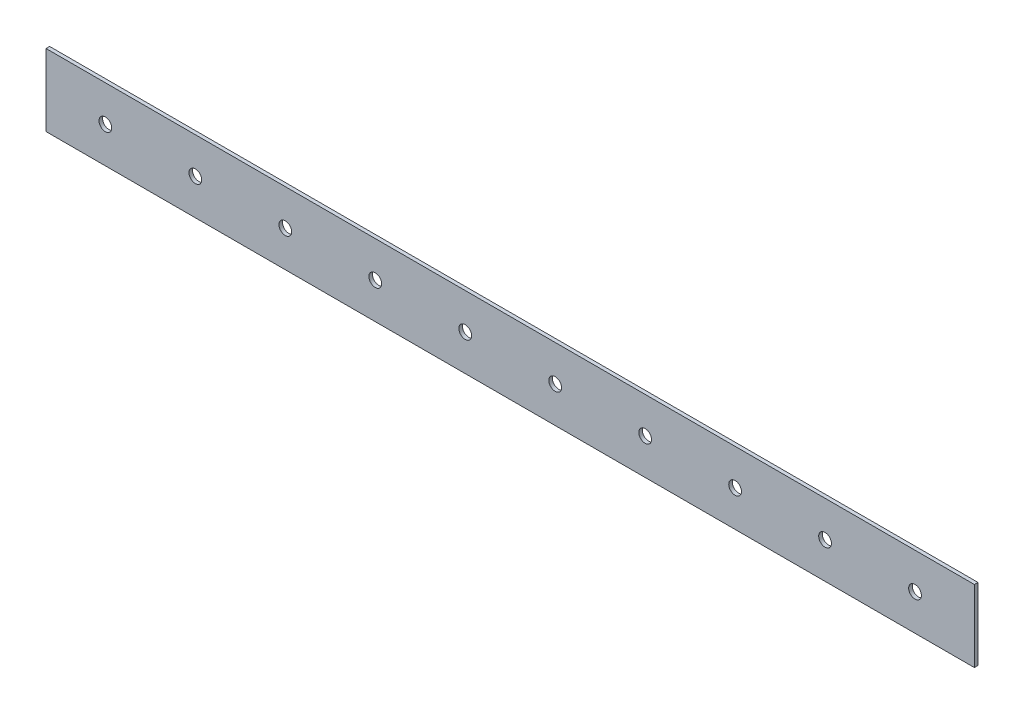
ISO-10303-21;
HEADER;
FILE_DESCRIPTION(('STEP AP214'),'2;1');
FILE_NAME('part.step','',(''),(''),'','','');
FILE_SCHEMA(('AUTOMOTIVE_DESIGN { 1 0 10303 214 1 1 1 1 }'));
ENDSEC;
DATA;
#1=APPLICATION_CONTEXT('core data for automotive mechanical design processes');
#2=APPLICATION_PROTOCOL_DEFINITION('international standard','automotive_design',2000,#1);
#3=PRODUCT_CONTEXT('',#1,'mechanical');
#4=PRODUCT('Part','Part','',(#3));
#5=PRODUCT_RELATED_PRODUCT_CATEGORY('part','',(#4));
#6=PRODUCT_DEFINITION_FORMATION('','',#4);
#7=PRODUCT_DEFINITION_CONTEXT('part definition',#1,'design');
#8=PRODUCT_DEFINITION('design','',#6,#7);
#9=PRODUCT_DEFINITION_SHAPE('','',#8);
#10=(LENGTH_UNIT() NAMED_UNIT(*) SI_UNIT(.MILLI.,.METRE.));
#11=(NAMED_UNIT(*) PLANE_ANGLE_UNIT() SI_UNIT($,.RADIAN.));
#12=(NAMED_UNIT(*) SI_UNIT($,.STERADIAN.) SOLID_ANGLE_UNIT());
#13=UNCERTAINTY_MEASURE_WITH_UNIT(LENGTH_MEASURE(1.E-05),#10,'distance_accuracy_value','');
#14=(GEOMETRIC_REPRESENTATION_CONTEXT(3) GLOBAL_UNCERTAINTY_ASSIGNED_CONTEXT((#13)) GLOBAL_UNIT_ASSIGNED_CONTEXT((#10,
#11,#12)) REPRESENTATION_CONTEXT('',''));
#15=CARTESIAN_POINT('',(0.,0.,0.));
#16=DIRECTION('',(0.,0.,1.));
#17=DIRECTION('',(1.,0.,0.));
#18=AXIS2_PLACEMENT_3D('',#15,#16,#17);
#19=CARTESIAN_POINT('',(0.,0.,1.));
#20=DIRECTION('',(0.,0.,1.));
#21=DIRECTION('',(1.,0.,0.));
#22=AXIS2_PLACEMENT_3D('',#19,#20,#21);
#23=PLANE('',#22);
#24=CARTESIAN_POINT('',(37.5000000000001,0.,1.));
#25=DIRECTION('',(0.,0.,1.));
#26=DIRECTION('',(-1.,0.,0.));
#27=AXIS2_PLACEMENT_3D('',#24,#25,#26);
#28=CIRCLE('',#27,1.77114070835533);
#29=CARTESIAN_POINT('',(35.7288592916447,0.,1.));
#30=VERTEX_POINT('',#29);
#31=EDGE_CURVE('E190',#30,#30,#28,.T.);
#32=ORIENTED_EDGE('',*,*,#31,.F.);
#33=EDGE_LOOP('',(#32));
#34=FACE_BOUND('',#33,.T.);
#35=CARTESIAN_POINT('',(87.5000000000001,0.,1.));
#36=DIRECTION('',(0.,0.,1.));
#37=DIRECTION('',(-1.,0.,0.));
#38=AXIS2_PLACEMENT_3D('',#35,#36,#37);
#39=CIRCLE('',#38,1.77114070835534);
#40=CARTESIAN_POINT('',(85.7288592916447,0.,1.));
#41=VERTEX_POINT('',#40);
#42=EDGE_CURVE('E174',#41,#41,#39,.T.);
#43=ORIENTED_EDGE('',*,*,#42,.F.);
#44=EDGE_LOOP('',(#43));
#45=FACE_BOUND('',#44,.T.);
#46=CARTESIAN_POINT('',(-112.5,-7.03296523219515E-13,1.));
#47=DIRECTION('',(0.,0.,1.));
#48=DIRECTION('',(1.,0.,0.));
#49=AXIS2_PLACEMENT_3D('',#46,#47,#48);
#50=CIRCLE('',#49,1.77114070835532);
#51=CARTESIAN_POINT('',(-110.728859291645,-7.03296523219515E-13,1.));
#52=VERTEX_POINT('',#51);
#53=EDGE_CURVE('E158',#52,#52,#50,.T.);
#54=ORIENTED_EDGE('',*,*,#53,.F.);
#55=EDGE_LOOP('',(#54));
#56=FACE_BOUND('',#55,.T.);
#57=CARTESIAN_POINT('',(-62.5,-3.54148389335201E-13,1.));
#58=DIRECTION('',(0.,0.,1.));
#59=DIRECTION('',(1.,0.,0.));
#60=AXIS2_PLACEMENT_3D('',#57,#58,#59);
#61=CIRCLE('',#60,1.77114070835534);
#62=CARTESIAN_POINT('',(-60.7288592916447,-3.54148389335201E-13,1.));
#63=VERTEX_POINT('',#62);
#64=EDGE_CURVE('E142',#63,#63,#61,.T.);
#65=ORIENTED_EDGE('',*,*,#64,.F.);
#66=EDGE_LOOP('',(#65));
#67=FACE_BOUND('',#66,.T.);
#68=CARTESIAN_POINT('',(-12.5,0.,1.));
#69=DIRECTION('',(0.,0.,1.));
#70=DIRECTION('',(1.,0.,0.));
#71=AXIS2_PLACEMENT_3D('',#68,#69,#70);
#72=CIRCLE('',#71,1.77114070835533);
#73=CARTESIAN_POINT('',(-10.7288592916447,0.,1.));
#74=VERTEX_POINT('',#73);
#75=EDGE_CURVE('E112',#74,#74,#72,.T.);
#76=ORIENTED_EDGE('',*,*,#75,.F.);
#77=EDGE_LOOP('',(#76));
#78=FACE_BOUND('',#77,.T.);
#79=DIRECTION('',(0.,1.,0.));
#80=VECTOR('',#79,1.);
#81=CARTESIAN_POINT('',(129.,10.,1.));
#82=LINE('',#81,#80);
#83=CARTESIAN_POINT('',(129.,-10.,1.));
#84=VERTEX_POINT('',#83);
#85=CARTESIAN_POINT('',(129.,10.,1.));
#86=VERTEX_POINT('',#85);
#87=EDGE_CURVE('E92',#84,#86,#82,.T.);
#88=ORIENTED_EDGE('',*,*,#87,.T.);
#89=DIRECTION('',(-1.,0.,0.));
#90=VECTOR('',#89,1.);
#91=CARTESIAN_POINT('',(-129.,10.,1.));
#92=LINE('',#91,#90);
#93=CARTESIAN_POINT('',(-129.,10.,1.));
#94=VERTEX_POINT('',#93);
#95=EDGE_CURVE('E87',#86,#94,#92,.T.);
#96=ORIENTED_EDGE('',*,*,#95,.T.);
#97=DIRECTION('',(0.,-1.,0.));
#98=VECTOR('',#97,1.);
#99=CARTESIAN_POINT('',(-129.,10.,1.));
#100=LINE('',#99,#98);
#101=CARTESIAN_POINT('',(-129.,-10.,1.));
#102=VERTEX_POINT('',#101);
#103=EDGE_CURVE('E90',#94,#102,#100,.T.);
#104=ORIENTED_EDGE('',*,*,#103,.T.);
#105=DIRECTION('',(1.,0.,0.));
#106=VECTOR('',#105,1.);
#107=CARTESIAN_POINT('',(-129.,-10.,1.));
#108=LINE('',#107,#106);
#109=EDGE_CURVE('E57',#102,#84,#108,.T.);
#110=ORIENTED_EDGE('',*,*,#109,.T.);
#111=EDGE_LOOP('',(#88,#96,#104,#110));
#112=FACE_BOUND('',#111,.T.);
#113=CARTESIAN_POINT('',(-37.5,-1.79574322393045E-13,1.));
#114=DIRECTION('',(0.,0.,1.));
#115=DIRECTION('',(1.,0.,0.));
#116=AXIS2_PLACEMENT_3D('',#113,#114,#115);
#117=CIRCLE('',#116,1.77114070835533);
#118=CARTESIAN_POINT('',(-35.7288592916447,-1.79574322393045E-13,1.));
#119=VERTEX_POINT('',#118);
#120=EDGE_CURVE('E134',#119,#119,#117,.T.);
#121=ORIENTED_EDGE('',*,*,#120,.F.);
#122=EDGE_LOOP('',(#121));
#123=FACE_BOUND('',#122,.T.);
#124=CARTESIAN_POINT('',(-87.5,-5.28722456277358E-13,1.));
#125=DIRECTION('',(0.,0.,1.));
#126=DIRECTION('',(1.,0.,0.));
#127=AXIS2_PLACEMENT_3D('',#124,#125,#126);
#128=CIRCLE('',#127,1.77114070835534);
#129=CARTESIAN_POINT('',(-85.7288592916447,-5.28722456277358E-13,1.));
#130=VERTEX_POINT('',#129);
#131=EDGE_CURVE('E150',#130,#130,#128,.T.);
#132=ORIENTED_EDGE('',*,*,#131,.F.);
#133=EDGE_LOOP('',(#132));
#134=FACE_BOUND('',#133,.T.);
#135=CARTESIAN_POINT('',(112.5,0.,1.));
#136=DIRECTION('',(0.,0.,1.));
#137=DIRECTION('',(-1.,0.,0.));
#138=AXIS2_PLACEMENT_3D('',#135,#136,#137);
#139=CIRCLE('',#138,1.77114070835532);
#140=CARTESIAN_POINT('',(110.728859291645,0.,1.));
#141=VERTEX_POINT('',#140);
#142=EDGE_CURVE('E166',#141,#141,#139,.T.);
#143=ORIENTED_EDGE('',*,*,#142,.F.);
#144=EDGE_LOOP('',(#143));
#145=FACE_BOUND('',#144,.T.);
#146=CARTESIAN_POINT('',(62.5000000000001,0.,1.));
#147=DIRECTION('',(0.,0.,1.));
#148=DIRECTION('',(-1.,0.,0.));
#149=AXIS2_PLACEMENT_3D('',#146,#147,#148);
#150=CIRCLE('',#149,1.77114070835534);
#151=CARTESIAN_POINT('',(60.7288592916447,0.,1.));
#152=VERTEX_POINT('',#151);
#153=EDGE_CURVE('E182',#152,#152,#150,.T.);
#154=ORIENTED_EDGE('',*,*,#153,.F.);
#155=EDGE_LOOP('',(#154));
#156=FACE_BOUND('',#155,.T.);
#157=CARTESIAN_POINT('',(12.5000000000001,0.,1.));
#158=DIRECTION('',(0.,0.,1.));
#159=DIRECTION('',(-1.,0.,0.));
#160=AXIS2_PLACEMENT_3D('',#157,#158,#159);
#161=CIRCLE('',#160,1.77114070835534);
#162=CARTESIAN_POINT('',(10.7288592916447,0.,1.));
#163=VERTEX_POINT('',#162);
#164=EDGE_CURVE('E198',#163,#163,#161,.T.);
#165=ORIENTED_EDGE('',*,*,#164,.F.);
#166=EDGE_LOOP('',(#165));
#167=FACE_BOUND('',#166,.T.);
#168=ADVANCED_FACE('F39',(#34,#45,#56,#67,#78,#112,#123,#134,#145,#156,#167),#23,.T.);
#169=CARTESIAN_POINT('',(0.,0.,0.));
#170=DIRECTION('',(0.,0.,1.));
#171=DIRECTION('',(1.,0.,0.));
#172=AXIS2_PLACEMENT_3D('',#169,#170,#171);
#173=PLANE('',#172);
#174=DIRECTION('',(0.,1.,0.));
#175=VECTOR('',#174,1.);
#176=CARTESIAN_POINT('',(129.,10.,0.));
#177=LINE('',#176,#175);
#178=CARTESIAN_POINT('',(129.,-10.,0.));
#179=VERTEX_POINT('',#178);
#180=CARTESIAN_POINT('',(129.,10.,0.));
#181=VERTEX_POINT('',#180);
#182=EDGE_CURVE('E108',#179,#181,#177,.T.);
#183=ORIENTED_EDGE('',*,*,#182,.F.);
#184=DIRECTION('',(1.,0.,0.));
#185=VECTOR('',#184,1.);
#186=CARTESIAN_POINT('',(-129.,-10.,0.));
#187=LINE('',#186,#185);
#188=CARTESIAN_POINT('',(-129.,-10.,0.));
#189=VERTEX_POINT('',#188);
#190=EDGE_CURVE('E80',#189,#179,#187,.T.);
#191=ORIENTED_EDGE('',*,*,#190,.F.);
#192=DIRECTION('',(0.,-1.,0.));
#193=VECTOR('',#192,1.);
#194=CARTESIAN_POINT('',(-129.,10.,0.));
#195=LINE('',#194,#193);
#196=CARTESIAN_POINT('',(-129.,10.,0.));
#197=VERTEX_POINT('',#196);
#198=EDGE_CURVE('E74',#197,#189,#195,.T.);
#199=ORIENTED_EDGE('',*,*,#198,.F.);
#200=DIRECTION('',(-1.,0.,0.));
#201=VECTOR('',#200,1.);
#202=CARTESIAN_POINT('',(-129.,10.,0.));
#203=LINE('',#202,#201);
#204=EDGE_CURVE('E97',#181,#197,#203,.T.);
#205=ORIENTED_EDGE('',*,*,#204,.F.);
#206=EDGE_LOOP('',(#183,#191,#199,#205));
#207=FACE_BOUND('',#206,.T.);
#208=CARTESIAN_POINT('',(-12.5,0.,0.));
#209=DIRECTION('',(0.,0.,1.));
#210=DIRECTION('',(1.,0.,0.));
#211=AXIS2_PLACEMENT_3D('',#208,#209,#210);
#212=CIRCLE('',#211,1.77114070835533);
#213=CARTESIAN_POINT('',(-10.7288592916447,0.,0.));
#214=VERTEX_POINT('',#213);
#215=EDGE_CURVE('E130',#214,#214,#212,.T.);
#216=ORIENTED_EDGE('',*,*,#215,.T.);
#217=EDGE_LOOP('',(#216));
#218=FACE_BOUND('',#217,.T.);
#219=CARTESIAN_POINT('',(-37.5,-1.79574322393045E-13,0.));
#220=DIRECTION('',(0.,0.,1.));
#221=DIRECTION('',(1.,0.,0.));
#222=AXIS2_PLACEMENT_3D('',#219,#220,#221);
#223=CIRCLE('',#222,1.77114070835533);
#224=CARTESIAN_POINT('',(-35.7288592916447,-1.79574322393045E-13,0.));
#225=VERTEX_POINT('',#224);
#226=EDGE_CURVE('E138',#225,#225,#223,.T.);
#227=ORIENTED_EDGE('',*,*,#226,.T.);
#228=EDGE_LOOP('',(#227));
#229=FACE_BOUND('',#228,.T.);
#230=CARTESIAN_POINT('',(-62.5,-3.54148389335201E-13,0.));
#231=DIRECTION('',(0.,0.,1.));
#232=DIRECTION('',(1.,0.,0.));
#233=AXIS2_PLACEMENT_3D('',#230,#231,#232);
#234=CIRCLE('',#233,1.77114070835534);
#235=CARTESIAN_POINT('',(-60.7288592916447,-3.54148389335201E-13,0.));
#236=VERTEX_POINT('',#235);
#237=EDGE_CURVE('E146',#236,#236,#234,.T.);
#238=ORIENTED_EDGE('',*,*,#237,.T.);
#239=EDGE_LOOP('',(#238));
#240=FACE_BOUND('',#239,.T.);
#241=CARTESIAN_POINT('',(-87.5,-5.28722456277358E-13,0.));
#242=DIRECTION('',(0.,0.,1.));
#243=DIRECTION('',(1.,0.,0.));
#244=AXIS2_PLACEMENT_3D('',#241,#242,#243);
#245=CIRCLE('',#244,1.77114070835534);
#246=CARTESIAN_POINT('',(-85.7288592916447,-5.28722456277358E-13,0.));
#247=VERTEX_POINT('',#246);
#248=EDGE_CURVE('E154',#247,#247,#245,.T.);
#249=ORIENTED_EDGE('',*,*,#248,.T.);
#250=EDGE_LOOP('',(#249));
#251=FACE_BOUND('',#250,.T.);
#252=CARTESIAN_POINT('',(-112.5,-7.03296523219515E-13,0.));
#253=DIRECTION('',(0.,0.,1.));
#254=DIRECTION('',(1.,0.,0.));
#255=AXIS2_PLACEMENT_3D('',#252,#253,#254);
#256=CIRCLE('',#255,1.77114070835532);
#257=CARTESIAN_POINT('',(-110.728859291645,-7.03296523219515E-13,0.));
#258=VERTEX_POINT('',#257);
#259=EDGE_CURVE('E162',#258,#258,#256,.T.);
#260=ORIENTED_EDGE('',*,*,#259,.T.);
#261=EDGE_LOOP('',(#260));
#262=FACE_BOUND('',#261,.T.);
#263=CARTESIAN_POINT('',(112.5,0.,0.));
#264=DIRECTION('',(0.,0.,1.));
#265=DIRECTION('',(-1.,0.,0.));
#266=AXIS2_PLACEMENT_3D('',#263,#264,#265);
#267=CIRCLE('',#266,1.77114070835532);
#268=CARTESIAN_POINT('',(110.728859291645,0.,0.));
#269=VERTEX_POINT('',#268);
#270=EDGE_CURVE('E170',#269,#269,#267,.T.);
#271=ORIENTED_EDGE('',*,*,#270,.T.);
#272=EDGE_LOOP('',(#271));
#273=FACE_BOUND('',#272,.T.);
#274=CARTESIAN_POINT('',(87.5000000000001,0.,0.));
#275=DIRECTION('',(0.,0.,1.));
#276=DIRECTION('',(-1.,0.,0.));
#277=AXIS2_PLACEMENT_3D('',#274,#275,#276);
#278=CIRCLE('',#277,1.77114070835534);
#279=CARTESIAN_POINT('',(85.7288592916447,0.,0.));
#280=VERTEX_POINT('',#279);
#281=EDGE_CURVE('E178',#280,#280,#278,.T.);
#282=ORIENTED_EDGE('',*,*,#281,.T.);
#283=EDGE_LOOP('',(#282));
#284=FACE_BOUND('',#283,.T.);
#285=CARTESIAN_POINT('',(62.5000000000001,0.,0.));
#286=DIRECTION('',(0.,0.,1.));
#287=DIRECTION('',(-1.,0.,0.));
#288=AXIS2_PLACEMENT_3D('',#285,#286,#287);
#289=CIRCLE('',#288,1.77114070835534);
#290=CARTESIAN_POINT('',(60.7288592916447,0.,0.));
#291=VERTEX_POINT('',#290);
#292=EDGE_CURVE('E186',#291,#291,#289,.T.);
#293=ORIENTED_EDGE('',*,*,#292,.T.);
#294=EDGE_LOOP('',(#293));
#295=FACE_BOUND('',#294,.T.);
#296=CARTESIAN_POINT('',(37.5000000000001,0.,0.));
#297=DIRECTION('',(0.,0.,1.));
#298=DIRECTION('',(-1.,0.,0.));
#299=AXIS2_PLACEMENT_3D('',#296,#297,#298);
#300=CIRCLE('',#299,1.77114070835533);
#301=CARTESIAN_POINT('',(35.7288592916447,0.,0.));
#302=VERTEX_POINT('',#301);
#303=EDGE_CURVE('E194',#302,#302,#300,.T.);
#304=ORIENTED_EDGE('',*,*,#303,.T.);
#305=EDGE_LOOP('',(#304));
#306=FACE_BOUND('',#305,.T.);
#307=CARTESIAN_POINT('',(12.5000000000001,0.,0.));
#308=DIRECTION('',(0.,0.,1.));
#309=DIRECTION('',(-1.,0.,0.));
#310=AXIS2_PLACEMENT_3D('',#307,#308,#309);
#311=CIRCLE('',#310,1.77114070835534);
#312=CARTESIAN_POINT('',(10.7288592916447,0.,0.));
#313=VERTEX_POINT('',#312);
#314=EDGE_CURVE('E202',#313,#313,#311,.T.);
#315=ORIENTED_EDGE('',*,*,#314,.T.);
#316=EDGE_LOOP('',(#315));
#317=FACE_BOUND('',#316,.T.);
#318=ADVANCED_FACE('F125',(#207,#218,#229,#240,#251,#262,#273,#284,#295,#306,#317),#173,.F.);
#319=CARTESIAN_POINT('',(129.,10.,1.));
#320=DIRECTION('',(-1.,0.,0.));
#321=DIRECTION('',(0.,0.,1.));
#322=AXIS2_PLACEMENT_3D('',#319,#320,#321);
#323=PLANE('',#322);
#324=ORIENTED_EDGE('',*,*,#182,.T.);
#325=DIRECTION('',(0.,0.,-1.));
#326=VECTOR('',#325,1.);
#327=CARTESIAN_POINT('',(129.,10.,1.));
#328=LINE('',#327,#326);
#329=EDGE_CURVE('E11',#86,#181,#328,.T.);
#330=ORIENTED_EDGE('',*,*,#329,.F.);
#331=ORIENTED_EDGE('',*,*,#87,.F.);
#332=DIRECTION('',(0.,0.,-1.));
#333=VECTOR('',#332,1.);
#334=CARTESIAN_POINT('',(129.,-10.,1.));
#335=LINE('',#334,#333);
#336=EDGE_CURVE('E104',#84,#179,#335,.T.);
#337=ORIENTED_EDGE('',*,*,#336,.T.);
#338=EDGE_LOOP('',(#324,#330,#331,#337));
#339=FACE_BOUND('',#338,.T.);
#340=ADVANCED_FACE('F41',(#339),#323,.F.);
#341=CARTESIAN_POINT('',(-129.,10.,1.));
#342=DIRECTION('',(0.,-1.,0.));
#343=DIRECTION('',(0.,0.,-1.));
#344=AXIS2_PLACEMENT_3D('',#341,#342,#343);
#345=PLANE('',#344);
#346=ORIENTED_EDGE('',*,*,#204,.T.);
#347=DIRECTION('',(0.,0.,-1.));
#348=VECTOR('',#347,1.);
#349=CARTESIAN_POINT('',(-129.,10.,1.));
#350=LINE('',#349,#348);
#351=EDGE_CURVE('E49',#94,#197,#350,.T.);
#352=ORIENTED_EDGE('',*,*,#351,.F.);
#353=ORIENTED_EDGE('',*,*,#95,.F.);
#354=ORIENTED_EDGE('',*,*,#329,.T.);
#355=EDGE_LOOP('',(#346,#352,#353,#354));
#356=FACE_BOUND('',#355,.T.);
#357=ADVANCED_FACE('F96',(#356),#345,.F.);
#358=CARTESIAN_POINT('',(-129.,10.,1.));
#359=DIRECTION('',(1.,0.,0.));
#360=DIRECTION('',(0.,0.,-1.));
#361=AXIS2_PLACEMENT_3D('',#358,#359,#360);
#362=PLANE('',#361);
#363=ORIENTED_EDGE('',*,*,#198,.T.);
#364=DIRECTION('',(0.,0.,-1.));
#365=VECTOR('',#364,1.);
#366=CARTESIAN_POINT('',(-129.,-10.,1.));
#367=LINE('',#366,#365);
#368=EDGE_CURVE('E99',#102,#189,#367,.T.);
#369=ORIENTED_EDGE('',*,*,#368,.F.);
#370=ORIENTED_EDGE('',*,*,#103,.F.);
#371=ORIENTED_EDGE('',*,*,#351,.T.);
#372=EDGE_LOOP('',(#363,#369,#370,#371));
#373=FACE_BOUND('',#372,.T.);
#374=ADVANCED_FACE('F100',(#373),#362,.F.);
#375=CARTESIAN_POINT('',(-129.,-10.,1.));
#376=DIRECTION('',(0.,1.,0.));
#377=DIRECTION('',(0.,0.,1.));
#378=AXIS2_PLACEMENT_3D('',#375,#376,#377);
#379=PLANE('',#378);
#380=ORIENTED_EDGE('',*,*,#190,.T.);
#381=ORIENTED_EDGE('',*,*,#336,.F.);
#382=ORIENTED_EDGE('',*,*,#109,.F.);
#383=ORIENTED_EDGE('',*,*,#368,.T.);
#384=EDGE_LOOP('',(#380,#381,#382,#383));
#385=FACE_BOUND('',#384,.T.);
#386=ADVANCED_FACE('F122',(#385),#379,.F.);
#387=CARTESIAN_POINT('',(-12.5,0.,1.));
#388=DIRECTION('',(0.,0.,-1.));
#389=DIRECTION('',(-1.,0.,0.));
#390=AXIS2_PLACEMENT_3D('',#387,#388,#389);
#391=CYLINDRICAL_SURFACE('',#390,1.77114070835533);
#392=ORIENTED_EDGE('',*,*,#75,.T.);
#393=EDGE_LOOP('',(#392));
#394=FACE_BOUND('',#393,.T.);
#395=ORIENTED_EDGE('',*,*,#215,.F.);
#396=EDGE_LOOP('',(#395));
#397=FACE_BOUND('',#396,.T.);
#398=ADVANCED_FACE('F223',(#394,#397),#391,.F.);
#399=CARTESIAN_POINT('',(-37.5,-1.79574322393045E-13,1.));
#400=DIRECTION('',(0.,0.,-1.));
#401=DIRECTION('',(-1.,0.,0.));
#402=AXIS2_PLACEMENT_3D('',#399,#400,#401);
#403=CYLINDRICAL_SURFACE('',#402,1.77114070835533);
#404=ORIENTED_EDGE('',*,*,#120,.T.);
#405=EDGE_LOOP('',(#404));
#406=FACE_BOUND('',#405,.T.);
#407=ORIENTED_EDGE('',*,*,#226,.F.);
#408=EDGE_LOOP('',(#407));
#409=FACE_BOUND('',#408,.T.);
#410=ADVANCED_FACE('F269',(#406,#409),#403,.F.);
#411=CARTESIAN_POINT('',(-62.5,-3.54148389335201E-13,1.));
#412=DIRECTION('',(0.,0.,-1.));
#413=DIRECTION('',(-1.,0.,0.));
#414=AXIS2_PLACEMENT_3D('',#411,#412,#413);
#415=CYLINDRICAL_SURFACE('',#414,1.77114070835534);
#416=ORIENTED_EDGE('',*,*,#64,.T.);
#417=EDGE_LOOP('',(#416));
#418=FACE_BOUND('',#417,.T.);
#419=ORIENTED_EDGE('',*,*,#237,.F.);
#420=EDGE_LOOP('',(#419));
#421=FACE_BOUND('',#420,.T.);
#422=ADVANCED_FACE('F277',(#418,#421),#415,.F.);
#423=CARTESIAN_POINT('',(-87.5,-5.28722456277358E-13,1.));
#424=DIRECTION('',(0.,0.,-1.));
#425=DIRECTION('',(-1.,0.,0.));
#426=AXIS2_PLACEMENT_3D('',#423,#424,#425);
#427=CYLINDRICAL_SURFACE('',#426,1.77114070835534);
#428=ORIENTED_EDGE('',*,*,#131,.T.);
#429=EDGE_LOOP('',(#428));
#430=FACE_BOUND('',#429,.T.);
#431=ORIENTED_EDGE('',*,*,#248,.F.);
#432=EDGE_LOOP('',(#431));
#433=FACE_BOUND('',#432,.T.);
#434=ADVANCED_FACE('F285',(#430,#433),#427,.F.);
#435=CARTESIAN_POINT('',(-112.5,-7.03296523219515E-13,1.));
#436=DIRECTION('',(0.,0.,-1.));
#437=DIRECTION('',(-1.,0.,0.));
#438=AXIS2_PLACEMENT_3D('',#435,#436,#437);
#439=CYLINDRICAL_SURFACE('',#438,1.77114070835532);
#440=ORIENTED_EDGE('',*,*,#53,.T.);
#441=EDGE_LOOP('',(#440));
#442=FACE_BOUND('',#441,.T.);
#443=ORIENTED_EDGE('',*,*,#259,.F.);
#444=EDGE_LOOP('',(#443));
#445=FACE_BOUND('',#444,.T.);
#446=ADVANCED_FACE('F294',(#442,#445),#439,.F.);
#447=CARTESIAN_POINT('',(112.5,0.,1.));
#448=DIRECTION('',(0.,0.,-1.));
#449=DIRECTION('',(-1.,0.,0.));
#450=AXIS2_PLACEMENT_3D('',#447,#448,#449);
#451=CYLINDRICAL_SURFACE('',#450,1.77114070835532);
#452=ORIENTED_EDGE('',*,*,#142,.T.);
#453=EDGE_LOOP('',(#452));
#454=FACE_BOUND('',#453,.T.);
#455=ORIENTED_EDGE('',*,*,#270,.F.);
#456=EDGE_LOOP('',(#455));
#457=FACE_BOUND('',#456,.T.);
#458=ADVANCED_FACE('F303',(#454,#457),#451,.F.);
#459=CARTESIAN_POINT('',(87.5000000000001,0.,1.));
#460=DIRECTION('',(0.,0.,-1.));
#461=DIRECTION('',(-1.,0.,0.));
#462=AXIS2_PLACEMENT_3D('',#459,#460,#461);
#463=CYLINDRICAL_SURFACE('',#462,1.77114070835534);
#464=ORIENTED_EDGE('',*,*,#42,.T.);
#465=EDGE_LOOP('',(#464));
#466=FACE_BOUND('',#465,.T.);
#467=ORIENTED_EDGE('',*,*,#281,.F.);
#468=EDGE_LOOP('',(#467));
#469=FACE_BOUND('',#468,.T.);
#470=ADVANCED_FACE('F312',(#466,#469),#463,.F.);
#471=CARTESIAN_POINT('',(62.5000000000001,0.,1.));
#472=DIRECTION('',(0.,0.,-1.));
#473=DIRECTION('',(-1.,0.,0.));
#474=AXIS2_PLACEMENT_3D('',#471,#472,#473);
#475=CYLINDRICAL_SURFACE('',#474,1.77114070835534);
#476=ORIENTED_EDGE('',*,*,#153,.T.);
#477=EDGE_LOOP('',(#476));
#478=FACE_BOUND('',#477,.T.);
#479=ORIENTED_EDGE('',*,*,#292,.F.);
#480=EDGE_LOOP('',(#479));
#481=FACE_BOUND('',#480,.T.);
#482=ADVANCED_FACE('F321',(#478,#481),#475,.F.);
#483=CARTESIAN_POINT('',(37.5000000000001,0.,1.));
#484=DIRECTION('',(0.,0.,-1.));
#485=DIRECTION('',(-1.,0.,0.));
#486=AXIS2_PLACEMENT_3D('',#483,#484,#485);
#487=CYLINDRICAL_SURFACE('',#486,1.77114070835533);
#488=ORIENTED_EDGE('',*,*,#31,.T.);
#489=EDGE_LOOP('',(#488));
#490=FACE_BOUND('',#489,.T.);
#491=ORIENTED_EDGE('',*,*,#303,.F.);
#492=EDGE_LOOP('',(#491));
#493=FACE_BOUND('',#492,.T.);
#494=ADVANCED_FACE('F330',(#490,#493),#487,.F.);
#495=CARTESIAN_POINT('',(12.5000000000001,0.,1.));
#496=DIRECTION('',(0.,0.,-1.));
#497=DIRECTION('',(-1.,0.,0.));
#498=AXIS2_PLACEMENT_3D('',#495,#496,#497);
#499=CYLINDRICAL_SURFACE('',#498,1.77114070835534);
#500=ORIENTED_EDGE('',*,*,#164,.T.);
#501=EDGE_LOOP('',(#500));
#502=FACE_BOUND('',#501,.T.);
#503=ORIENTED_EDGE('',*,*,#314,.F.);
#504=EDGE_LOOP('',(#503));
#505=FACE_BOUND('',#504,.T.);
#506=ADVANCED_FACE('F210',(#502,#505),#499,.F.);
#507=CLOSED_SHELL('',(#168,#318,#340,#357,#374,#386,#398,#410,#422,#434,#446,#458,#470,#482,
#494,#506));
#508=MANIFOLD_SOLID_BREP('B2',#507);
#509=ADVANCED_BREP_SHAPE_REPRESENTATION('',(#18,#508),#14);
#510=SHAPE_DEFINITION_REPRESENTATION(#9,#509);
ENDSEC;
END-ISO-10303-21;
